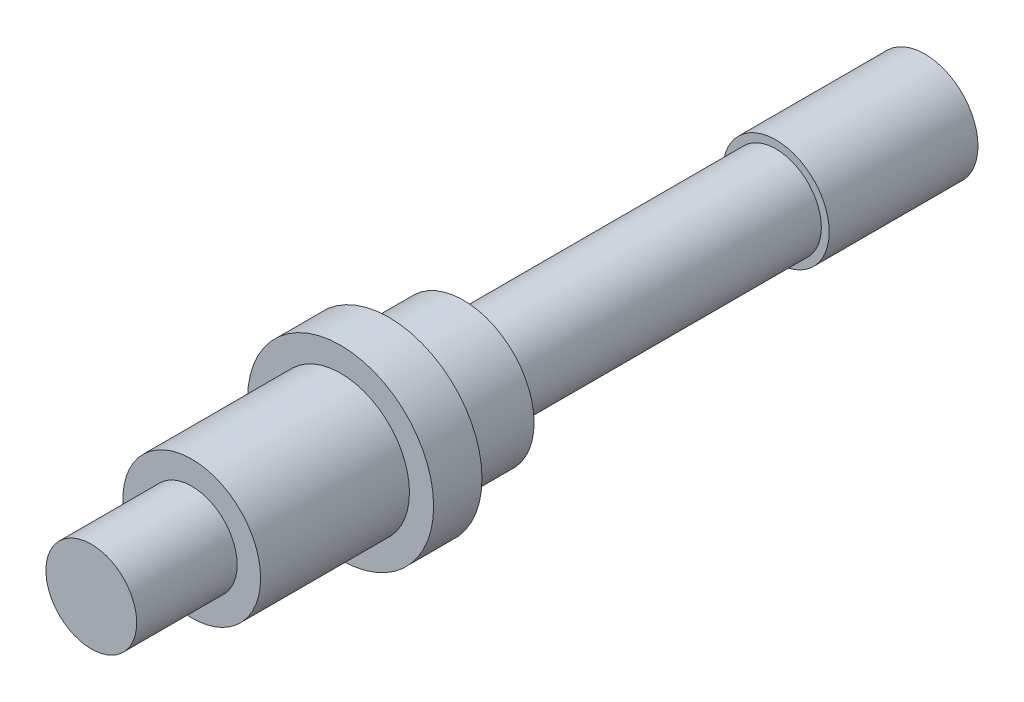
ISO-10303-21;
HEADER;
FILE_DESCRIPTION(('STEP AP214'),'2;1');
FILE_NAME('part.step','',(''),(''),'','','');
FILE_SCHEMA(('AUTOMOTIVE_DESIGN { 1 0 10303 214 1 1 1 1 }'));
ENDSEC;
DATA;
#1=APPLICATION_CONTEXT('core data for automotive mechanical design processes');
#2=APPLICATION_PROTOCOL_DEFINITION('international standard','automotive_design',2000,#1);
#3=PRODUCT_CONTEXT('',#1,'mechanical');
#4=PRODUCT('Part','Part','',(#3));
#5=PRODUCT_RELATED_PRODUCT_CATEGORY('part','',(#4));
#6=PRODUCT_DEFINITION_FORMATION('','',#4);
#7=PRODUCT_DEFINITION_CONTEXT('part definition',#1,'design');
#8=PRODUCT_DEFINITION('design','',#6,#7);
#9=PRODUCT_DEFINITION_SHAPE('','',#8);
#10=(LENGTH_UNIT() NAMED_UNIT(*) SI_UNIT(.MILLI.,.METRE.));
#11=(NAMED_UNIT(*) PLANE_ANGLE_UNIT() SI_UNIT($,.RADIAN.));
#12=(NAMED_UNIT(*) SI_UNIT($,.STERADIAN.) SOLID_ANGLE_UNIT());
#13=UNCERTAINTY_MEASURE_WITH_UNIT(LENGTH_MEASURE(1.E-05),#10,'distance_accuracy_value','');
#14=(GEOMETRIC_REPRESENTATION_CONTEXT(3) GLOBAL_UNCERTAINTY_ASSIGNED_CONTEXT((#13)) GLOBAL_UNIT_ASSIGNED_CONTEXT((#10,
#11,#12)) REPRESENTATION_CONTEXT('',''));
#15=CARTESIAN_POINT('',(0.,0.,0.));
#16=DIRECTION('',(0.,0.,1.));
#17=DIRECTION('',(1.,0.,0.));
#18=AXIS2_PLACEMENT_3D('',#15,#16,#17);
#19=CARTESIAN_POINT('',(0.,0.,0.));
#20=DIRECTION('',(0.,0.,-1.));
#21=DIRECTION('',(-1.,0.,0.));
#22=AXIS2_PLACEMENT_3D('',#19,#20,#21);
#23=PLANE('',#22);
#24=CARTESIAN_POINT('',(0.,0.,0.));
#25=DIRECTION('',(0.,0.,1.));
#26=DIRECTION('',(1.,0.,0.));
#27=AXIS2_PLACEMENT_3D('',#24,#25,#26);
#28=CIRCLE('',#27,14.3);
#29=CARTESIAN_POINT('',(14.3,0.,0.));
#30=VERTEX_POINT('',#29);
#31=EDGE_CURVE('E10',#30,#30,#28,.T.);
#32=ORIENTED_EDGE('',*,*,#31,.F.);
#33=EDGE_LOOP('',(#32));
#34=FACE_BOUND('',#33,.T.);
#35=ADVANCED_FACE('F37',(#34),#23,.T.);
#36=CARTESIAN_POINT('',(0.,0.,139.012446794337));
#37=DIRECTION('',(0.,0.,1.));
#38=DIRECTION('',(1.,0.,0.));
#39=AXIS2_PLACEMENT_3D('',#36,#37,#38);
#40=CYLINDRICAL_SURFACE('',#39,14.3);
#41=ORIENTED_EDGE('',*,*,#31,.T.);
#42=EDGE_LOOP('',(#41));
#43=FACE_BOUND('',#42,.T.);
#44=CARTESIAN_POINT('',(0.,0.,40.));
#45=DIRECTION('',(0.,0.,1.));
#46=DIRECTION('',(1.,0.,0.));
#47=AXIS2_PLACEMENT_3D('',#44,#45,#46);
#48=CIRCLE('',#47,14.3);
#49=CARTESIAN_POINT('',(14.3,0.,40.));
#50=VERTEX_POINT('',#49);
#51=EDGE_CURVE('E43',#50,#50,#48,.T.);
#52=ORIENTED_EDGE('',*,*,#51,.F.);
#53=EDGE_LOOP('',(#52));
#54=FACE_BOUND('',#53,.T.);
#55=ADVANCED_FACE('F97',(#43,#54),#40,.T.);
#56=CARTESIAN_POINT('',(14.3,0.,40.));
#57=DIRECTION('',(0.,0.,1.));
#58=DIRECTION('',(1.,0.,0.));
#59=AXIS2_PLACEMENT_3D('',#56,#57,#58);
#60=PLANE('',#59);
#61=ORIENTED_EDGE('',*,*,#51,.T.);
#62=EDGE_LOOP('',(#61));
#63=FACE_BOUND('',#62,.T.);
#64=CARTESIAN_POINT('',(0.,0.,40.));
#65=DIRECTION('',(0.,0.,1.));
#66=DIRECTION('',(1.,0.,0.));
#67=AXIS2_PLACEMENT_3D('',#64,#65,#66);
#68=CIRCLE('',#67,12.2);
#69=CARTESIAN_POINT('',(12.2,0.,40.));
#70=VERTEX_POINT('',#69);
#71=EDGE_CURVE('E47',#70,#70,#68,.T.);
#72=ORIENTED_EDGE('',*,*,#71,.F.);
#73=EDGE_LOOP('',(#72));
#74=FACE_BOUND('',#73,.T.);
#75=ADVANCED_FACE('F102',(#63,#74),#60,.T.);
#76=CARTESIAN_POINT('',(0.,0.,139.012446794337));
#77=DIRECTION('',(0.,0.,1.));
#78=DIRECTION('',(1.,0.,0.));
#79=AXIS2_PLACEMENT_3D('',#76,#77,#78);
#80=CYLINDRICAL_SURFACE('',#79,12.2);
#81=ORIENTED_EDGE('',*,*,#71,.T.);
#82=EDGE_LOOP('',(#81));
#83=FACE_BOUND('',#82,.T.);
#84=CARTESIAN_POINT('',(0.,0.,124.));
#85=DIRECTION('',(0.,0.,1.));
#86=DIRECTION('',(1.,0.,0.));
#87=AXIS2_PLACEMENT_3D('',#84,#85,#86);
#88=CIRCLE('',#87,12.2);
#89=CARTESIAN_POINT('',(12.2,0.,124.));
#90=VERTEX_POINT('',#89);
#91=EDGE_CURVE('E51',#90,#90,#88,.T.);
#92=ORIENTED_EDGE('',*,*,#91,.F.);
#93=EDGE_LOOP('',(#92));
#94=FACE_BOUND('',#93,.T.);
#95=ADVANCED_FACE('F106',(#83,#94),#80,.T.);
#96=CARTESIAN_POINT('',(12.2,0.,124.));
#97=DIRECTION('',(0.,0.,-1.));
#98=DIRECTION('',(-1.,0.,0.));
#99=AXIS2_PLACEMENT_3D('',#96,#97,#98);
#100=PLANE('',#99);
#101=ORIENTED_EDGE('',*,*,#91,.T.);
#102=EDGE_LOOP('',(#101));
#103=FACE_BOUND('',#102,.T.);
#104=CARTESIAN_POINT('',(0.,0.,124.));
#105=DIRECTION('',(0.,0.,1.));
#106=DIRECTION('',(1.,0.,0.));
#107=AXIS2_PLACEMENT_3D('',#104,#105,#106);
#108=CIRCLE('',#107,19.);
#109=CARTESIAN_POINT('',(19.,0.,124.));
#110=VERTEX_POINT('',#109);
#111=EDGE_CURVE('E56',#110,#110,#108,.T.);
#112=ORIENTED_EDGE('',*,*,#111,.F.);
#113=EDGE_LOOP('',(#112));
#114=FACE_BOUND('',#113,.T.);
#115=ADVANCED_FACE('F112',(#103,#114),#100,.T.);
#116=CARTESIAN_POINT('',(0.,0.,139.012446794337));
#117=DIRECTION('',(0.,0.,1.));
#118=DIRECTION('',(1.,0.,0.));
#119=AXIS2_PLACEMENT_3D('',#116,#117,#118);
#120=CYLINDRICAL_SURFACE('',#119,19.);
#121=ORIENTED_EDGE('',*,*,#111,.T.);
#122=EDGE_LOOP('',(#121));
#123=FACE_BOUND('',#122,.T.);
#124=CARTESIAN_POINT('',(0.,0.,144.));
#125=DIRECTION('',(0.,0.,1.));
#126=DIRECTION('',(1.,0.,0.));
#127=AXIS2_PLACEMENT_3D('',#124,#125,#126);
#128=CIRCLE('',#127,19.);
#129=CARTESIAN_POINT('',(19.,0.,144.));
#130=VERTEX_POINT('',#129);
#131=EDGE_CURVE('E59',#130,#130,#128,.T.);
#132=ORIENTED_EDGE('',*,*,#131,.F.);
#133=EDGE_LOOP('',(#132));
#134=FACE_BOUND('',#133,.T.);
#135=ADVANCED_FACE('F116',(#123,#134),#120,.T.);
#136=CARTESIAN_POINT('',(19.,0.,144.));
#137=DIRECTION('',(0.,0.,-1.));
#138=DIRECTION('',(-1.,0.,0.));
#139=AXIS2_PLACEMENT_3D('',#136,#137,#138);
#140=PLANE('',#139);
#141=ORIENTED_EDGE('',*,*,#131,.T.);
#142=EDGE_LOOP('',(#141));
#143=FACE_BOUND('',#142,.T.);
#144=CARTESIAN_POINT('',(0.,0.,144.));
#145=DIRECTION('',(0.,0.,1.));
#146=DIRECTION('',(1.,0.,0.));
#147=AXIS2_PLACEMENT_3D('',#144,#145,#146);
#148=CIRCLE('',#147,25.);
#149=CARTESIAN_POINT('',(25.,0.,144.));
#150=VERTEX_POINT('',#149);
#151=EDGE_CURVE('E62',#150,#150,#148,.T.);
#152=ORIENTED_EDGE('',*,*,#151,.F.);
#153=EDGE_LOOP('',(#152));
#154=FACE_BOUND('',#153,.T.);
#155=ADVANCED_FACE('F120',(#143,#154),#140,.T.);
#156=CARTESIAN_POINT('',(0.,0.,139.012446794337));
#157=DIRECTION('',(0.,0.,1.));
#158=DIRECTION('',(1.,0.,0.));
#159=AXIS2_PLACEMENT_3D('',#156,#157,#158);
#160=CYLINDRICAL_SURFACE('',#159,25.);
#161=ORIENTED_EDGE('',*,*,#151,.T.);
#162=EDGE_LOOP('',(#161));
#163=FACE_BOUND('',#162,.T.);
#164=CARTESIAN_POINT('',(0.,0.,157.));
#165=DIRECTION('',(0.,0.,1.));
#166=DIRECTION('',(1.,0.,0.));
#167=AXIS2_PLACEMENT_3D('',#164,#165,#166);
#168=CIRCLE('',#167,25.);
#169=CARTESIAN_POINT('',(25.,0.,157.));
#170=VERTEX_POINT('',#169);
#171=EDGE_CURVE('E65',#170,#170,#168,.T.);
#172=ORIENTED_EDGE('',*,*,#171,.F.);
#173=EDGE_LOOP('',(#172));
#174=FACE_BOUND('',#173,.T.);
#175=ADVANCED_FACE('F124',(#163,#174),#160,.T.);
#176=CARTESIAN_POINT('',(25.,0.,157.));
#177=DIRECTION('',(0.,0.,1.));
#178=DIRECTION('',(1.,0.,0.));
#179=AXIS2_PLACEMENT_3D('',#176,#177,#178);
#180=PLANE('',#179);
#181=ORIENTED_EDGE('',*,*,#171,.T.);
#182=EDGE_LOOP('',(#181));
#183=FACE_BOUND('',#182,.T.);
#184=CARTESIAN_POINT('',(0.,0.,157.));
#185=DIRECTION('',(0.,0.,1.));
#186=DIRECTION('',(1.,0.,0.));
#187=AXIS2_PLACEMENT_3D('',#184,#185,#186);
#188=CIRCLE('',#187,18.5);
#189=CARTESIAN_POINT('',(18.5,0.,157.));
#190=VERTEX_POINT('',#189);
#191=EDGE_CURVE('E68',#190,#190,#188,.T.);
#192=ORIENTED_EDGE('',*,*,#191,.F.);
#193=EDGE_LOOP('',(#192));
#194=FACE_BOUND('',#193,.T.);
#195=ADVANCED_FACE('F128',(#183,#194),#180,.T.);
#196=CARTESIAN_POINT('',(0.,0.,139.012446794337));
#197=DIRECTION('',(0.,0.,1.));
#198=DIRECTION('',(1.,0.,0.));
#199=AXIS2_PLACEMENT_3D('',#196,#197,#198);
#200=CYLINDRICAL_SURFACE('',#199,18.5);
#201=ORIENTED_EDGE('',*,*,#191,.T.);
#202=EDGE_LOOP('',(#201));
#203=FACE_BOUND('',#202,.T.);
#204=CARTESIAN_POINT('',(0.,0.,197.));
#205=DIRECTION('',(0.,0.,1.));
#206=DIRECTION('',(1.,0.,0.));
#207=AXIS2_PLACEMENT_3D('',#204,#205,#206);
#208=CIRCLE('',#207,18.5);
#209=CARTESIAN_POINT('',(18.5,0.,197.));
#210=VERTEX_POINT('',#209);
#211=EDGE_CURVE('E71',#210,#210,#208,.T.);
#212=ORIENTED_EDGE('',*,*,#211,.F.);
#213=EDGE_LOOP('',(#212));
#214=FACE_BOUND('',#213,.T.);
#215=ADVANCED_FACE('F93',(#203,#214),#200,.T.);
#216=CARTESIAN_POINT('',(18.5,0.,197.));
#217=DIRECTION('',(0.,0.,1.));
#218=DIRECTION('',(1.,0.,0.));
#219=AXIS2_PLACEMENT_3D('',#216,#217,#218);
#220=PLANE('',#219);
#221=ORIENTED_EDGE('',*,*,#211,.T.);
#222=EDGE_LOOP('',(#221));
#223=FACE_BOUND('',#222,.T.);
#224=CARTESIAN_POINT('',(0.,0.,197.));
#225=DIRECTION('',(0.,0.,1.));
#226=DIRECTION('',(1.,0.,0.));
#227=AXIS2_PLACEMENT_3D('',#224,#225,#226);
#228=CIRCLE('',#227,12.2);
#229=CARTESIAN_POINT('',(12.2,0.,197.));
#230=VERTEX_POINT('',#229);
#231=EDGE_CURVE('E74',#230,#230,#228,.T.);
#232=ORIENTED_EDGE('',*,*,#231,.F.);
#233=EDGE_LOOP('',(#232));
#234=FACE_BOUND('',#233,.T.);
#235=ADVANCED_FACE('F85',(#223,#234),#220,.T.);
#236=CARTESIAN_POINT('',(0.,0.,139.012446794337));
#237=DIRECTION('',(0.,0.,1.));
#238=DIRECTION('',(1.,0.,0.));
#239=AXIS2_PLACEMENT_3D('',#236,#237,#238);
#240=CYLINDRICAL_SURFACE('',#239,12.2);
#241=ORIENTED_EDGE('',*,*,#231,.T.);
#242=EDGE_LOOP('',(#241));
#243=FACE_BOUND('',#242,.T.);
#244=CARTESIAN_POINT('',(0.,0.,224.));
#245=DIRECTION('',(0.,0.,1.));
#246=DIRECTION('',(1.,0.,0.));
#247=AXIS2_PLACEMENT_3D('',#244,#245,#246);
#248=CIRCLE('',#247,12.2);
#249=CARTESIAN_POINT('',(12.2,0.,224.));
#250=VERTEX_POINT('',#249);
#251=EDGE_CURVE('E77',#250,#250,#248,.T.);
#252=ORIENTED_EDGE('',*,*,#251,.F.);
#253=EDGE_LOOP('',(#252));
#254=FACE_BOUND('',#253,.T.);
#255=ADVANCED_FACE('F83',(#243,#254),#240,.T.);
#256=CARTESIAN_POINT('',(12.2,0.,224.));
#257=DIRECTION('',(0.,0.,1.));
#258=DIRECTION('',(1.,0.,0.));
#259=AXIS2_PLACEMENT_3D('',#256,#257,#258);
#260=PLANE('',#259);
#261=ORIENTED_EDGE('',*,*,#251,.T.);
#262=EDGE_LOOP('',(#261));
#263=FACE_BOUND('',#262,.T.);
#264=ADVANCED_FACE('F81',(#263),#260,.T.);
#265=CLOSED_SHELL('',(#35,#55,#75,#95,#115,#135,#155,#175,#195,#215,#235,#255,#264));
#266=MANIFOLD_SOLID_BREP('B2',#265);
#267=ADVANCED_BREP_SHAPE_REPRESENTATION('',(#18,#266),#14);
#268=SHAPE_DEFINITION_REPRESENTATION(#9,#267);
ENDSEC;
END-ISO-10303-21;
